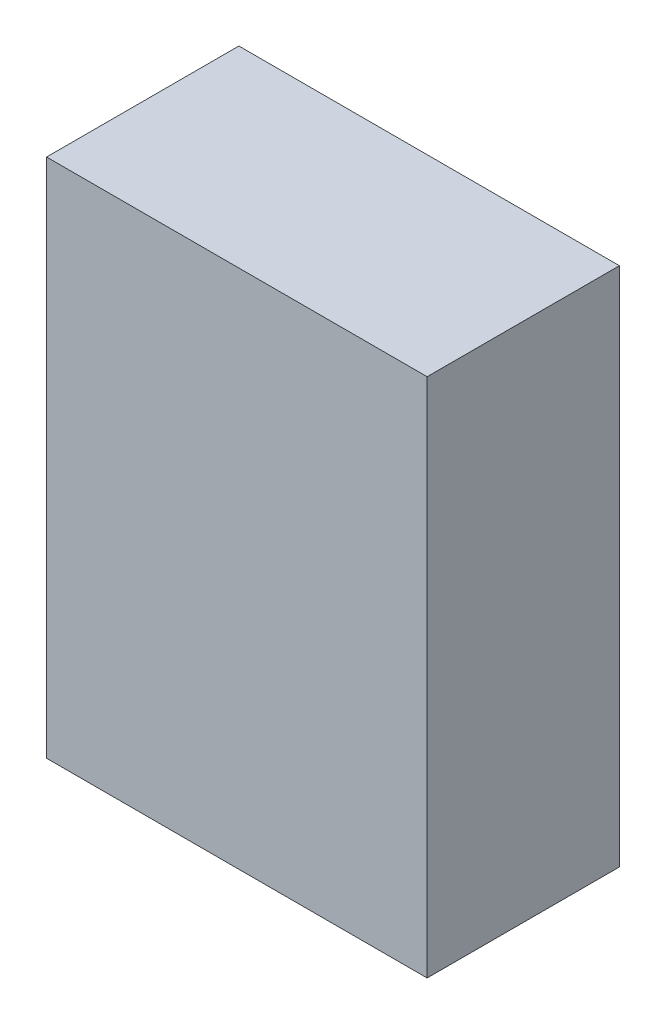
ISO-10303-21;
HEADER;
FILE_DESCRIPTION(('STEP AP214'),'2;1');
FILE_NAME('part.step','',(''),(''),'','','');
FILE_SCHEMA(('AUTOMOTIVE_DESIGN { 1 0 10303 214 1 1 1 1 }'));
ENDSEC;
DATA;
#1=APPLICATION_CONTEXT('core data for automotive mechanical design processes');
#2=APPLICATION_PROTOCOL_DEFINITION('international standard','automotive_design',2000,#1);
#3=PRODUCT_CONTEXT('',#1,'mechanical');
#4=PRODUCT('Part','Part','',(#3));
#5=PRODUCT_RELATED_PRODUCT_CATEGORY('part','',(#4));
#6=PRODUCT_DEFINITION_FORMATION('','',#4);
#7=PRODUCT_DEFINITION_CONTEXT('part definition',#1,'design');
#8=PRODUCT_DEFINITION('design','',#6,#7);
#9=PRODUCT_DEFINITION_SHAPE('','',#8);
#10=(LENGTH_UNIT() NAMED_UNIT(*) SI_UNIT(.MILLI.,.METRE.));
#11=(NAMED_UNIT(*) PLANE_ANGLE_UNIT() SI_UNIT($,.RADIAN.));
#12=(NAMED_UNIT(*) SI_UNIT($,.STERADIAN.) SOLID_ANGLE_UNIT());
#13=UNCERTAINTY_MEASURE_WITH_UNIT(LENGTH_MEASURE(1.E-05),#10,'distance_accuracy_value','');
#14=(GEOMETRIC_REPRESENTATION_CONTEXT(3) GLOBAL_UNCERTAINTY_ASSIGNED_CONTEXT((#13)) GLOBAL_UNIT_ASSIGNED_CONTEXT((#10,
#11,#12)) REPRESENTATION_CONTEXT('',''));
#15=CARTESIAN_POINT('',(0.,0.,0.));
#16=DIRECTION('',(0.,0.,1.));
#17=DIRECTION('',(1.,0.,0.));
#18=AXIS2_PLACEMENT_3D('',#15,#16,#17);
#19=CARTESIAN_POINT('',(0.,0.,24.));
#20=DIRECTION('',(1.,0.,0.));
#21=DIRECTION('',(0.,0.,-1.));
#22=AXIS2_PLACEMENT_3D('',#19,#20,#21);
#23=PLANE('',#22);
#24=DIRECTION('',(0.,-1.,0.));
#25=VECTOR('',#24,1.);
#26=CARTESIAN_POINT('',(0.,0.,0.));
#27=LINE('',#26,#25);
#28=CARTESIAN_POINT('',(0.,65.,0.));
#29=VERTEX_POINT('',#28);
#30=CARTESIAN_POINT('',(0.,0.,0.));
#31=VERTEX_POINT('',#30);
#32=EDGE_CURVE('E107',#29,#31,#27,.T.);
#33=ORIENTED_EDGE('',*,*,#32,.T.);
#34=DIRECTION('',(0.,0.,-1.));
#35=VECTOR('',#34,1.);
#36=CARTESIAN_POINT('',(0.,0.,24.));
#37=LINE('',#36,#35);
#38=CARTESIAN_POINT('',(0.,0.,24.));
#39=VERTEX_POINT('',#38);
#40=EDGE_CURVE('E11',#39,#31,#37,.T.);
#41=ORIENTED_EDGE('',*,*,#40,.F.);
#42=DIRECTION('',(0.,-1.,0.));
#43=VECTOR('',#42,1.);
#44=CARTESIAN_POINT('',(0.,0.,24.));
#45=LINE('',#44,#43);
#46=CARTESIAN_POINT('',(0.,65.,24.));
#47=VERTEX_POINT('',#46);
#48=EDGE_CURVE('E91',#47,#39,#45,.T.);
#49=ORIENTED_EDGE('',*,*,#48,.F.);
#50=DIRECTION('',(0.,0.,-1.));
#51=VECTOR('',#50,1.);
#52=CARTESIAN_POINT('',(0.,65.,24.));
#53=LINE('',#52,#51);
#54=EDGE_CURVE('E103',#47,#29,#53,.T.);
#55=ORIENTED_EDGE('',*,*,#54,.T.);
#56=EDGE_LOOP('',(#33,#41,#49,#55));
#57=FACE_BOUND('',#56,.T.);
#58=ADVANCED_FACE('F39',(#57),#23,.F.);
#59=CARTESIAN_POINT('',(0.,0.,24.));
#60=DIRECTION('',(0.,1.,0.));
#61=DIRECTION('',(0.,0.,1.));
#62=AXIS2_PLACEMENT_3D('',#59,#60,#61);
#63=PLANE('',#62);
#64=DIRECTION('',(1.,0.,0.));
#65=VECTOR('',#64,1.);
#66=CARTESIAN_POINT('',(0.,0.,0.));
#67=LINE('',#66,#65);
#68=CARTESIAN_POINT('',(47.5,0.,0.));
#69=VERTEX_POINT('',#68);
#70=EDGE_CURVE('E96',#31,#69,#67,.T.);
#71=ORIENTED_EDGE('',*,*,#70,.T.);
#72=DIRECTION('',(0.,0.,-1.));
#73=VECTOR('',#72,1.);
#74=CARTESIAN_POINT('',(47.5,0.,24.));
#75=LINE('',#74,#73);
#76=CARTESIAN_POINT('',(47.5,0.,24.));
#77=VERTEX_POINT('',#76);
#78=EDGE_CURVE('E48',#77,#69,#75,.T.);
#79=ORIENTED_EDGE('',*,*,#78,.F.);
#80=DIRECTION('',(1.,0.,0.));
#81=VECTOR('',#80,1.);
#82=CARTESIAN_POINT('',(0.,0.,24.));
#83=LINE('',#82,#81);
#84=EDGE_CURVE('E86',#39,#77,#83,.T.);
#85=ORIENTED_EDGE('',*,*,#84,.F.);
#86=ORIENTED_EDGE('',*,*,#40,.T.);
#87=EDGE_LOOP('',(#71,#79,#85,#86));
#88=FACE_BOUND('',#87,.T.);
#89=ADVANCED_FACE('F95',(#88),#63,.F.);
#90=CARTESIAN_POINT('',(47.5,0.,24.));
#91=DIRECTION('',(-1.,0.,0.));
#92=DIRECTION('',(0.,0.,1.));
#93=AXIS2_PLACEMENT_3D('',#90,#91,#92);
#94=PLANE('',#93);
#95=DIRECTION('',(0.,1.,0.));
#96=VECTOR('',#95,1.);
#97=CARTESIAN_POINT('',(47.5,0.,0.));
#98=LINE('',#97,#96);
#99=CARTESIAN_POINT('',(47.5,65.,0.));
#100=VERTEX_POINT('',#99);
#101=EDGE_CURVE('E73',#69,#100,#98,.T.);
#102=ORIENTED_EDGE('',*,*,#101,.T.);
#103=DIRECTION('',(0.,0.,-1.));
#104=VECTOR('',#103,1.);
#105=CARTESIAN_POINT('',(47.5,65.,24.));
#106=LINE('',#105,#104);
#107=CARTESIAN_POINT('',(47.5,65.,24.));
#108=VERTEX_POINT('',#107);
#109=EDGE_CURVE('E98',#108,#100,#106,.T.);
#110=ORIENTED_EDGE('',*,*,#109,.F.);
#111=DIRECTION('',(0.,1.,0.));
#112=VECTOR('',#111,1.);
#113=CARTESIAN_POINT('',(47.5,0.,24.));
#114=LINE('',#113,#112);
#115=EDGE_CURVE('E89',#77,#108,#114,.T.);
#116=ORIENTED_EDGE('',*,*,#115,.F.);
#117=ORIENTED_EDGE('',*,*,#78,.T.);
#118=EDGE_LOOP('',(#102,#110,#116,#117));
#119=FACE_BOUND('',#118,.T.);
#120=ADVANCED_FACE('F99',(#119),#94,.F.);
#121=CARTESIAN_POINT('',(0.,65.,24.));
#122=DIRECTION('',(0.,-1.,0.));
#123=DIRECTION('',(0.,0.,-1.));
#124=AXIS2_PLACEMENT_3D('',#121,#122,#123);
#125=PLANE('',#124);
#126=DIRECTION('',(-1.,0.,0.));
#127=VECTOR('',#126,1.);
#128=CARTESIAN_POINT('',(0.,65.,0.));
#129=LINE('',#128,#127);
#130=EDGE_CURVE('E79',#100,#29,#129,.T.);
#131=ORIENTED_EDGE('',*,*,#130,.T.);
#132=ORIENTED_EDGE('',*,*,#54,.F.);
#133=DIRECTION('',(-1.,0.,0.));
#134=VECTOR('',#133,1.);
#135=CARTESIAN_POINT('',(0.,65.,24.));
#136=LINE('',#135,#134);
#137=EDGE_CURVE('E56',#108,#47,#136,.T.);
#138=ORIENTED_EDGE('',*,*,#137,.F.);
#139=ORIENTED_EDGE('',*,*,#109,.T.);
#140=EDGE_LOOP('',(#131,#132,#138,#139));
#141=FACE_BOUND('',#140,.T.);
#142=ADVANCED_FACE('F120',(#141),#125,.F.);
#143=CARTESIAN_POINT('',(0.,0.,24.));
#144=DIRECTION('',(0.,0.,-1.));
#145=DIRECTION('',(-1.,0.,0.));
#146=AXIS2_PLACEMENT_3D('',#143,#144,#145);
#147=PLANE('',#146);
#148=ORIENTED_EDGE('',*,*,#48,.T.);
#149=ORIENTED_EDGE('',*,*,#84,.T.);
#150=ORIENTED_EDGE('',*,*,#115,.T.);
#151=ORIENTED_EDGE('',*,*,#137,.T.);
#152=EDGE_LOOP('',(#148,#149,#150,#151));
#153=FACE_BOUND('',#152,.T.);
#154=ADVANCED_FACE('F87',(#153),#147,.F.);
#155=CARTESIAN_POINT('',(0.,0.,0.));
#156=DIRECTION('',(0.,0.,-1.));
#157=DIRECTION('',(-1.,0.,0.));
#158=AXIS2_PLACEMENT_3D('',#155,#156,#157);
#159=PLANE('',#158);
#160=ORIENTED_EDGE('',*,*,#32,.F.);
#161=ORIENTED_EDGE('',*,*,#130,.F.);
#162=ORIENTED_EDGE('',*,*,#101,.F.);
#163=ORIENTED_EDGE('',*,*,#70,.F.);
#164=EDGE_LOOP('',(#160,#161,#162,#163));
#165=FACE_BOUND('',#164,.T.);
#166=ADVANCED_FACE('F123',(#165),#159,.T.);
#167=CLOSED_SHELL('',(#58,#89,#120,#142,#154,#166));
#168=MANIFOLD_SOLID_BREP('B2',#167);
#169=ADVANCED_BREP_SHAPE_REPRESENTATION('',(#18,#168),#14);
#170=SHAPE_DEFINITION_REPRESENTATION(#9,#169);
ENDSEC;
END-ISO-10303-21;
